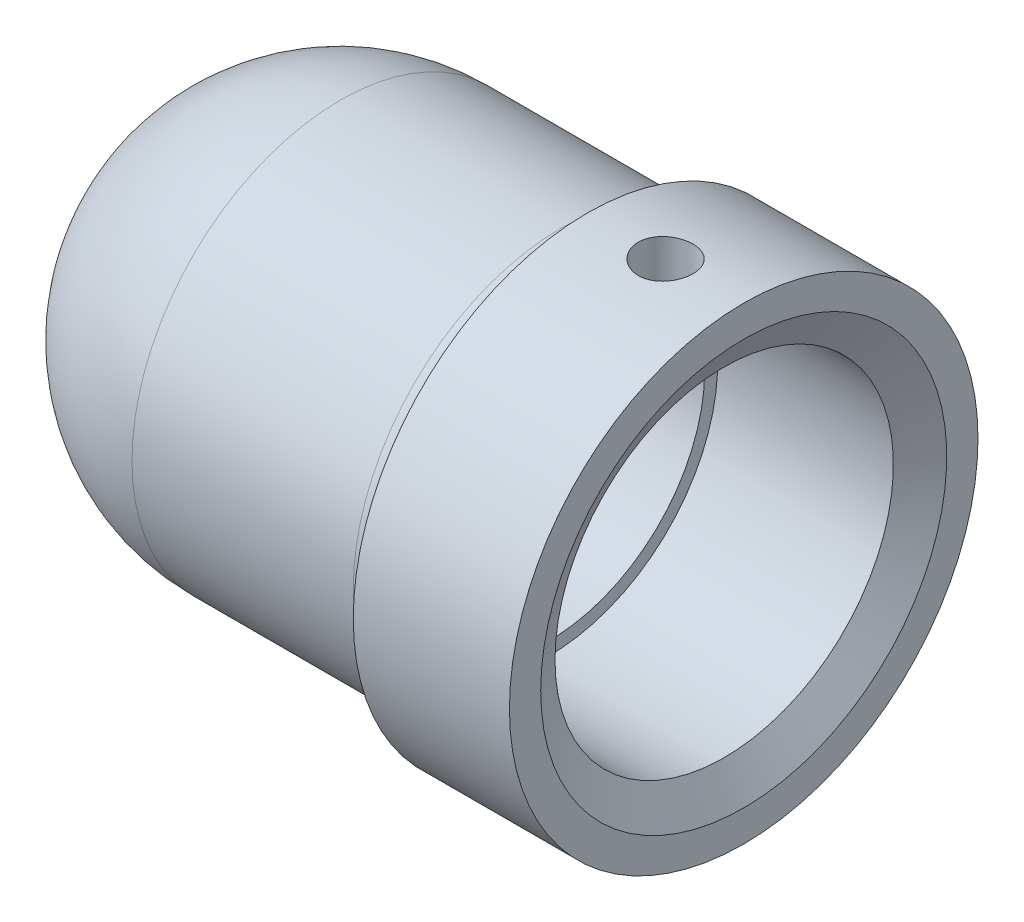
ISO-10303-21;
HEADER;
FILE_DESCRIPTION(('STEP AP214'),'2;1');
FILE_NAME('part.step','',(''),(''),'','','');
FILE_SCHEMA(('AUTOMOTIVE_DESIGN { 1 0 10303 214 1 1 1 1 }'));
ENDSEC;
DATA;
#1=APPLICATION_CONTEXT('core data for automotive mechanical design processes');
#2=APPLICATION_PROTOCOL_DEFINITION('international standard','automotive_design',2000,#1);
#3=PRODUCT_CONTEXT('',#1,'mechanical');
#4=PRODUCT('Part','Part','',(#3));
#5=PRODUCT_RELATED_PRODUCT_CATEGORY('part','',(#4));
#6=PRODUCT_DEFINITION_FORMATION('','',#4);
#7=PRODUCT_DEFINITION_CONTEXT('part definition',#1,'design');
#8=PRODUCT_DEFINITION('design','',#6,#7);
#9=PRODUCT_DEFINITION_SHAPE('','',#8);
#10=(LENGTH_UNIT() NAMED_UNIT(*) SI_UNIT(.MILLI.,.METRE.));
#11=(NAMED_UNIT(*) PLANE_ANGLE_UNIT() SI_UNIT($,.RADIAN.));
#12=(NAMED_UNIT(*) SI_UNIT($,.STERADIAN.) SOLID_ANGLE_UNIT());
#13=UNCERTAINTY_MEASURE_WITH_UNIT(LENGTH_MEASURE(1.E-05),#10,'distance_accuracy_value','');
#14=(GEOMETRIC_REPRESENTATION_CONTEXT(3) GLOBAL_UNCERTAINTY_ASSIGNED_CONTEXT((#13)) GLOBAL_UNIT_ASSIGNED_CONTEXT((#10,
#11,#12)) REPRESENTATION_CONTEXT('',''));
#15=CARTESIAN_POINT('',(0.,0.,0.));
#16=DIRECTION('',(0.,0.,1.));
#17=DIRECTION('',(1.,0.,0.));
#18=AXIS2_PLACEMENT_3D('',#15,#16,#17);
#19=CARTESIAN_POINT('',(-47.,0.,0.));
#20=DIRECTION('',(-1.,0.,0.));
#21=DIRECTION('',(0.,0.,1.));
#22=AXIS2_PLACEMENT_3D('',#19,#20,#21);
#23=CYLINDRICAL_SURFACE('',#22,18.);
#24=CARTESIAN_POINT('',(-6.,17.8770802985275,2.09999999999999));
#25=CARTESIAN_POINT('',(-6.11752645616681,17.8770818864204,2.09999496734066));
#26=CARTESIAN_POINT('',(-6.235127891991,17.8782517575098,2.0901006824873));
#27=CARTESIAN_POINT('',(-6.46706231413643,17.8828034722202,2.05078436303318));
#28=CARTESIAN_POINT('',(-6.58139168278845,17.8861876723897,2.0213415238432));
#29=CARTESIAN_POINT('',(-6.80339009875376,17.8947796228344,1.94380405102469));
#30=CARTESIAN_POINT('',(-6.91106344052113,17.8999861825685,1.89572159239352));
#31=CARTESIAN_POINT('',(-7.11679121928213,17.9116347599311,1.78229492172219));
#32=CARTESIAN_POINT('',(-7.21484739110572,17.9180765541152,1.71695383082906));
#33=CARTESIAN_POINT('',(-7.39905850158579,17.9315050853693,1.57052183285199));
#34=CARTESIAN_POINT('',(-7.4851596102785,17.9384940788681,1.48936340755517));
#35=CARTESIAN_POINT('',(-7.64255200455002,17.9522091735742,1.31374559042142));
#36=CARTESIAN_POINT('',(-7.71384257495208,17.9589352620735,1.21928555664088));
#37=CARTESIAN_POINT('',(-7.83978114657409,17.9713895546985,1.01941016968969));
#38=CARTESIAN_POINT('',(-7.89438076133712,17.9771148373621,0.913964131394348));
#39=CARTESIAN_POINT('',(-7.98507776521957,17.9868977093898,0.695321903094728));
#40=CARTESIAN_POINT('',(-8.02117575641367,17.990955353021,0.58212596542142));
#41=CARTESIAN_POINT('',(-8.07368489945681,17.9969298840528,0.351745814848304));
#42=CARTESIAN_POINT('',(-8.09018523981124,17.9988564670917,0.234582185589545));
#43=CARTESIAN_POINT('',(-8.10330694793459,18.0003848683715,-0.000865965834514741));
#44=CARTESIAN_POINT('',(-8.09992900252435,17.9999867669333,-0.119150449131855));
#45=CARTESIAN_POINT('',(-8.07346183055284,17.9969185305626,-0.352876323364038));
#46=CARTESIAN_POINT('',(-8.0504685173276,17.9942594513492,-0.468328741044821));
#47=CARTESIAN_POINT('',(-7.98557305502106,17.9869805436209,-0.693724797436983));
#48=CARTESIAN_POINT('',(-7.94367058619084,17.9823606819499,-0.803668342959832));
#49=CARTESIAN_POINT('',(-7.84204314361403,17.9716603516942,-1.01522462657681));
#50=CARTESIAN_POINT('',(-7.78227632870842,17.9655764607118,-1.11681708488158));
#51=CARTESIAN_POINT('',(-7.6466471687963,17.9526294571564,-1.30856611130692));
#52=CARTESIAN_POINT('',(-7.57078418058444,17.9457663134495,-1.39872222219934));
#53=CARTESIAN_POINT('',(-7.40457814567395,17.9319813991134,-1.56560223851656));
#54=CARTESIAN_POINT('',(-7.31415156264942,17.9250595227382,-1.64224296035511));
#55=CARTESIAN_POINT('',(-7.1216731289607,17.9119777702695,-1.77927104250137));
#56=CARTESIAN_POINT('',(-7.01962124979915,17.905817896044,-1.83965836296551));
#57=CARTESIAN_POINT('',(-6.80671863487478,17.8949574780013,-1.94246837033325));
#58=CARTESIAN_POINT('',(-6.69586491843214,17.8902574312136,-1.98488494049486));
#59=CARTESIAN_POINT('',(-6.468541385894,17.8828587604848,-2.05047848286092));
#60=CARTESIAN_POINT('',(-6.35207180473575,17.8801600528957,-2.07365625917429));
#61=CARTESIAN_POINT('',(-6.11755577763962,17.8770846613639,-2.10000525242062));
#62=CARTESIAN_POINT('',(-5.99952262753628,17.8766944195573,-2.10329328649739));
#63=CARTESIAN_POINT('',(-5.76458713594514,17.8782443194683,-2.09007717130031));
#64=CARTESIAN_POINT('',(-5.64768477357077,17.8801844180596,-2.07357338830369));
#65=CARTESIAN_POINT('',(-5.418675927714,17.8861640436326,-2.0213402581016));
#66=CARTESIAN_POINT('',(-5.30655647757573,17.8901974445467,-1.9856669998099));
#67=CARTESIAN_POINT('',(-5.08989139736234,17.8999042517962,-1.89616511689431));
#68=CARTESIAN_POINT('',(-4.98534600080134,17.905577708669,-1.84233593279786));
#69=CARTESIAN_POINT('',(-4.78626675665555,17.9179579816731,-1.71776105882806));
#70=CARTESIAN_POINT('',(-4.69178131941852,17.9246694441728,-1.64693847504007));
#71=CARTESIAN_POINT('',(-4.51599694781042,17.9383547201799,-1.49049643187036));
#72=CARTESIAN_POINT('',(-4.43469845935785,17.9453285425494,-1.40487647231544));
#73=CARTESIAN_POINT('',(-4.2871880781952,17.9587941676367,-1.22076106108728));
#74=CARTESIAN_POINT('',(-4.22105274921676,17.9652834171892,-1.12220405457313));
#75=CARTESIAN_POINT('',(-4.10627474946876,17.9770109351055,-0.915313233234862));
#76=CARTESIAN_POINT('',(-4.05763176554008,17.9822492258642,-0.806979593481697));
#77=CARTESIAN_POINT('',(-3.97934686886513,17.9908732183055,-0.583869692885966));
#78=CARTESIAN_POINT('',(-3.94965999730919,17.9942633006268,-0.469109383498855));
#79=CARTESIAN_POINT('',(-3.90998359093864,17.9988270254002,-0.236191108317691));
#80=CARTESIAN_POINT('',(-3.89999328800187,18.000000754285,-0.118033275201806));
#81=CARTESIAN_POINT('',(-3.90000667927658,17.9999992493617,0.117576836709851));
#82=CARTESIAN_POINT('',(-3.90989203463418,17.9988379184029,0.235029140027075));
#83=CARTESIAN_POINT('',(-3.94912638541441,17.9943243273082,0.466591522799102));
#84=CARTESIAN_POINT('',(-3.97847537881038,17.9909720674004,0.580701602601913));
#85=CARTESIAN_POINT('',(-4.05576824884148,17.982451784096,0.802329993460146));
#86=CARTESIAN_POINT('',(-4.10370722745843,17.9772842390176,0.909850032200096));
#87=CARTESIAN_POINT('',(-4.21680696803337,17.9657069524758,1.11533741947787));
#88=CARTESIAN_POINT('',(-4.28196782692261,17.9592972040209,1.213304714245));
#89=CARTESIAN_POINT('',(-4.42810195284893,17.945906330415,1.39751117316752));
#90=CARTESIAN_POINT('',(-4.50916337185366,17.9389221520962,1.48368018610945));
#91=CARTESIAN_POINT('',(-4.68461662291571,17.9251946044505,1.64124049803336));
#92=CARTESIAN_POINT('',(-4.77901162099352,17.9184512927944,1.7126282772974));
#93=CARTESIAN_POINT('',(-4.97881351239651,17.9059446975834,1.83880130231313));
#94=CARTESIAN_POINT('',(-5.08425651706147,17.9001848005505,1.89352966610306));
#95=CARTESIAN_POINT('',(-5.3028414681947,17.8903370303882,1.9844269015651));
#96=CARTESIAN_POINT('',(-5.41597477304573,17.8862473155469,2.02061622752467));
#97=CARTESIAN_POINT('',(-5.60809506067059,17.8812097988052,2.06461424564234));
#98=CARTESIAN_POINT('',(-5.68586393247999,17.8796688076276,2.07786516475665));
#99=CARTESIAN_POINT('',(-5.84241063467612,17.8776035282709,2.09555970170608));
#100=CARTESIAN_POINT('',(-5.92118845872605,17.8770792337095,2.10000337482853));
#101=CARTESIAN_POINT('',(-6.,17.8770802985275,2.09999999999999));
#102=B_SPLINE_CURVE_WITH_KNOTS('',3,(#24,#25,#26,#27,#28,#29,#30,#31,#32,#33,#34,#35,#36,#37,
#38,#39,#40,#41,#42,#43,#44,#45,#46,#47,#48,#49,#50,#51,#52,#53,#54,#55,#56,#57,#58,#59,#60,#61,
#62,#63,#64,#65,#66,#67,#68,#69,#70,#71,#72,#73,#74,#75,#76,#77,#78,#79,#80,#81,#82,#83,#84,#85,
#86,#87,#88,#89,#90,#91,#92,#93,#94,#95,#96,#97,#98,#99,#100,#101),.UNSPECIFIED.,.T.,.F.,(4,2,2,
2,2,2,2,2,2,2,2,2,2,2,2,2,2,2,2,2,2,2,2,2,2,2,2,2,2,2,2,2,2,2,2,2,2,2,4),(0.,0.35229149622184,
0.704958521659366,1.05739557968261,1.40976894461575,1.763680772691,2.11760968662127,
2.47255510444735,2.82748897100502,3.18080127473995,3.53410137114297,3.8856837719421,
4.23727211813123,4.58969048067586,4.94212292856122,5.29665405541565,5.65118605135951,
6.00583862334462,6.3604763714452,6.71302921022021,7.06557552457738,7.41709587868645,
7.76862706584061,8.12177994227905,8.47494475814266,8.82985536331887,9.18475961434264,
9.53881897024957,9.89286451835953,10.2448083362013,10.5967521173971,10.9486032327267,
11.3004563284493,11.6543182164622,12.008264269662,12.3634056212783,12.7181542937488,
12.9543973576015,13.190638938438),.UNSPECIFIED.);
#103=CARTESIAN_POINT('',(-6.,17.8770802985275,2.09999999999999));
#104=VERTEX_POINT('',#103);
#105=EDGE_CURVE('E10',#104,#104,#102,.T.);
#106=ORIENTED_EDGE('',*,*,#105,.T.);
#107=EDGE_LOOP('',(#106));
#108=FACE_BOUND('',#107,.T.);
#109=CARTESIAN_POINT('',(-12.,0.,0.));
#110=DIRECTION('',(-1.,0.,0.));
#111=DIRECTION('',(0.,0.,1.));
#112=AXIS2_PLACEMENT_3D('',#109,#110,#111);
#113=CIRCLE('',#112,18.);
#114=CARTESIAN_POINT('',(-12.,0.,18.));
#115=VERTEX_POINT('',#114);
#116=EDGE_CURVE('E75',#115,#115,#113,.T.);
#117=ORIENTED_EDGE('',*,*,#116,.F.);
#118=EDGE_LOOP('',(#117));
#119=FACE_BOUND('',#118,.T.);
#120=CARTESIAN_POINT('',(0.,0.,0.));
#121=DIRECTION('',(-1.,0.,0.));
#122=DIRECTION('',(0.,0.,1.));
#123=AXIS2_PLACEMENT_3D('',#120,#121,#122);
#124=CIRCLE('',#123,18.);
#125=CARTESIAN_POINT('',(0.,0.,18.));
#126=VERTEX_POINT('',#125);
#127=EDGE_CURVE('E95',#126,#126,#124,.T.);
#128=ORIENTED_EDGE('',*,*,#127,.T.);
#129=EDGE_LOOP('',(#128));
#130=FACE_BOUND('',#129,.T.);
#131=ADVANCED_FACE('F45',(#108,#119,#130),#23,.T.);
#132=CARTESIAN_POINT('',(-47.,0.,0.));
#133=DIRECTION('',(-1.,0.,0.));
#134=DIRECTION('',(0.,0.,1.));
#135=AXIS2_PLACEMENT_3D('',#132,#133,#134);
#136=CYLINDRICAL_SURFACE('',#135,16.);
#137=CARTESIAN_POINT('',(-14.,0.,0.));
#138=DIRECTION('',(1.,0.,0.));
#139=DIRECTION('',(0.,0.,-1.));
#140=AXIS2_PLACEMENT_3D('',#137,#138,#139);
#141=CIRCLE('',#140,16.);
#142=CARTESIAN_POINT('',(-14.,0.,-16.));
#143=VERTEX_POINT('',#142);
#144=EDGE_CURVE('E69',#143,#143,#141,.F.);
#145=ORIENTED_EDGE('',*,*,#144,.T.);
#146=EDGE_LOOP('',(#145));
#147=FACE_BOUND('',#146,.T.);
#148=CARTESIAN_POINT('',(-31.,0.,0.));
#149=DIRECTION('',(-1.,0.,0.));
#150=DIRECTION('',(0.,0.,1.));
#151=AXIS2_PLACEMENT_3D('',#148,#149,#150);
#152=CIRCLE('',#151,16.);
#153=CARTESIAN_POINT('',(-31.,0.,16.));
#154=VERTEX_POINT('',#153);
#155=EDGE_CURVE('E79',#154,#154,#152,.T.);
#156=ORIENTED_EDGE('',*,*,#155,.F.);
#157=EDGE_LOOP('',(#156));
#158=FACE_BOUND('',#157,.T.);
#159=ADVANCED_FACE('F128',(#147,#158),#136,.T.);
#160=CARTESIAN_POINT('',(-31.,0.,0.));
#161=DIRECTION('',(-1.,0.,0.));
#162=DIRECTION('',(0.,1.,0.));
#163=AXIS2_PLACEMENT_3D('',#160,#161,#162);
#164=SPHERICAL_SURFACE('',#163,16.);
#165=ORIENTED_EDGE('',*,*,#155,.T.);
#166=EDGE_LOOP('',(#165));
#167=FACE_BOUND('',#166,.T.);
#168=ADVANCED_FACE('F132',(#167),#164,.T.);
#169=CARTESIAN_POINT('',(-31.,0.,0.));
#170=DIRECTION('',(-1.,0.,0.));
#171=DIRECTION('',(0.,-1.,0.));
#172=AXIS2_PLACEMENT_3D('',#169,#170,#171);
#173=SPHERICAL_SURFACE('',#172,12.);
#174=CARTESIAN_POINT('',(-31.,0.,0.));
#175=DIRECTION('',(-1.,0.,0.));
#176=DIRECTION('',(0.,0.,1.));
#177=AXIS2_PLACEMENT_3D('',#174,#175,#176);
#178=CIRCLE('',#177,12.);
#179=CARTESIAN_POINT('',(-31.,0.,12.));
#180=VERTEX_POINT('',#179);
#181=EDGE_CURVE('E83',#180,#180,#178,.T.);
#182=ORIENTED_EDGE('',*,*,#181,.F.);
#183=EDGE_LOOP('',(#182));
#184=FACE_BOUND('',#183,.T.);
#185=ADVANCED_FACE('F140',(#184),#173,.F.);
#186=CARTESIAN_POINT('',(-47.,0.,0.));
#187=DIRECTION('',(-1.,0.,0.));
#188=DIRECTION('',(0.,0.,1.));
#189=AXIS2_PLACEMENT_3D('',#186,#187,#188);
#190=CYLINDRICAL_SURFACE('',#189,12.);
#191=CARTESIAN_POINT('',(-15.,0.,0.));
#192=DIRECTION('',(-1.,0.,0.));
#193=DIRECTION('',(0.,0.,1.));
#194=AXIS2_PLACEMENT_3D('',#191,#192,#193);
#195=CIRCLE('',#194,12.);
#196=CARTESIAN_POINT('',(-15.,0.,12.));
#197=VERTEX_POINT('',#196);
#198=EDGE_CURVE('E87',#197,#197,#195,.T.);
#199=ORIENTED_EDGE('',*,*,#198,.F.);
#200=EDGE_LOOP('',(#199));
#201=FACE_BOUND('',#200,.T.);
#202=ORIENTED_EDGE('',*,*,#181,.T.);
#203=EDGE_LOOP('',(#202));
#204=FACE_BOUND('',#203,.T.);
#205=ADVANCED_FACE('F144',(#201,#204),#190,.F.);
#206=CARTESIAN_POINT('',(-15.,12.,0.));
#207=DIRECTION('',(-1.,0.,0.));
#208=DIRECTION('',(0.,0.,1.));
#209=AXIS2_PLACEMENT_3D('',#206,#207,#208);
#210=PLANE('',#209);
#211=CARTESIAN_POINT('',(-15.,0.,0.));
#212=DIRECTION('',(-1.,0.,0.));
#213=DIRECTION('',(0.,0.,1.));
#214=AXIS2_PLACEMENT_3D('',#211,#212,#213);
#215=CIRCLE('',#214,13.);
#216=CARTESIAN_POINT('',(-15.,0.,13.));
#217=VERTEX_POINT('',#216);
#218=EDGE_CURVE('E91',#217,#217,#215,.T.);
#219=ORIENTED_EDGE('',*,*,#218,.F.);
#220=EDGE_LOOP('',(#219));
#221=FACE_BOUND('',#220,.T.);
#222=ORIENTED_EDGE('',*,*,#198,.T.);
#223=EDGE_LOOP('',(#222));
#224=FACE_BOUND('',#223,.T.);
#225=ADVANCED_FACE('F124',(#221,#224),#210,.F.);
#226=CARTESIAN_POINT('',(-47.,0.,0.));
#227=DIRECTION('',(-1.,0.,0.));
#228=DIRECTION('',(0.,0.,1.));
#229=AXIS2_PLACEMENT_3D('',#226,#227,#228);
#230=CYLINDRICAL_SURFACE('',#229,13.);
#231=CARTESIAN_POINT('',(-6.,12.8292634239071,2.09999999999999));
#232=CARTESIAN_POINT('',(-5.88287071414048,12.8292654929289,2.09999524890523));
#233=CARTESIAN_POINT('',(-5.76567617939393,12.830884858838,2.09016735047895));
#234=CARTESIAN_POINT('',(-5.53457167050811,12.8371819364284,2.05113038879794));
#235=CARTESIAN_POINT('',(-5.42066488596841,12.8418625202681,2.02190312389027));
#236=CARTESIAN_POINT('',(-5.19951410603195,12.8537383875686,1.94497146462564));
#237=CARTESIAN_POINT('',(-5.09226476970451,12.8609316237296,1.89728210969717));
#238=CARTESIAN_POINT('',(-4.88730274254683,12.8770198767998,1.78481682458169));
#239=CARTESIAN_POINT('',(-4.78958890439721,12.8859146885919,1.72004295349971));
#240=CARTESIAN_POINT('',(-4.605553376018,12.9044959892512,1.57460682803281));
#241=CARTESIAN_POINT('',(-4.51933286744318,12.9141884310935,1.49381728149883));
#242=CARTESIAN_POINT('',(-4.36160968374067,12.9332199375548,1.31891815417481));
#243=CARTESIAN_POINT('',(-4.2901078604399,12.942558981696,1.22480780299019));
#244=CARTESIAN_POINT('',(-4.16347395711029,12.9598942157763,1.02528519299712));
#245=CARTESIAN_POINT('',(-4.10843573791876,12.9678825972449,0.919812625856128));
#246=CARTESIAN_POINT('',(-4.01689436843555,12.9815502826702,0.700969042213666));
#247=CARTESIAN_POINT('',(-3.98039008518464,12.9872297277655,0.58759850898813));
#248=CARTESIAN_POINT('',(-3.92726142896037,12.9955976045503,0.357221544615438));
#249=CARTESIAN_POINT('',(-3.91046721839553,12.9983115748856,0.240255223490472));
#250=CARTESIAN_POINT('',(-3.89670755403499,13.0005303875825,0.00513550836021396));
#251=CARTESIAN_POINT('',(-3.89974083057969,13.0000354354286,-0.113017809151609));
#252=CARTESIAN_POINT('',(-3.92541708412065,12.9959124473986,-0.345997147549277));
#253=CARTESIAN_POINT('',(-3.94787730218072,12.9923136122018,-0.460843900467491));
#254=CARTESIAN_POINT('',(-4.01148238440932,12.9824197674574,-0.685116769766217));
#255=CARTESIAN_POINT('',(-4.05262779029033,12.9761246797417,-0.794542728887525));
#256=CARTESIAN_POINT('',(-4.15261864598365,12.9614957712914,-1.00541439612021));
#257=CARTESIAN_POINT('',(-4.2115399208968,12.953153245978,-1.10682352111585));
#258=CARTESIAN_POINT('',(-4.34535446645644,12.9353572609263,-1.29838410827844));
#259=CARTESIAN_POINT('',(-4.42024895319115,12.9259037166274,-1.38853471247161));
#260=CARTESIAN_POINT('',(-4.58489902868895,12.9068107770346,-1.5560982248581));
#261=CARTESIAN_POINT('',(-4.67481429928863,12.8971704916187,-1.63335420896292));
#262=CARTESIAN_POINT('',(-4.86641412478578,12.8788951056132,-1.77170707351364));
#263=CARTESIAN_POINT('',(-4.96809877588597,12.8702600132411,-1.83280382186083));
#264=CARTESIAN_POINT('',(-5.18052702241876,12.8549724726802,-1.93713166516613));
#265=CARTESIAN_POINT('',(-5.29127961701914,12.8483220252358,-1.98034474824248));
#266=CARTESIAN_POINT('',(-5.51860268453598,12.8377905681948,-2.04751074373919));
#267=CARTESIAN_POINT('',(-5.63517267720811,12.8339093303948,-2.07146524323139));
#268=CARTESIAN_POINT('',(-5.86942000427775,12.8293996264611,-2.09921495854837));
#269=CARTESIAN_POINT('',(-5.98707021524581,12.8287351322215,-2.10323347369273));
#270=CARTESIAN_POINT('',(-6.22136274575888,12.8306382883078,-2.09159139760148));
#271=CARTESIAN_POINT('',(-6.33800510162458,12.8332058216658,-2.07593151853162));
#272=CARTESIAN_POINT('',(-6.56626714435744,12.841250510832,-2.02556725161093));
#273=CARTESIAN_POINT('',(-6.67791240174656,12.8467104128338,-1.99097575616413));
#274=CARTESIAN_POINT('',(-6.89382096585454,12.8599102478941,-1.90384827341578));
#275=CARTESIAN_POINT('',(-6.99808385478985,12.8676503098639,-1.85131127151912));
#276=CARTESIAN_POINT('',(-7.19726413998145,12.8846224409588,-1.72925407557893));
#277=CARTESIAN_POINT('',(-7.29209249034317,12.8938668862644,-1.65959032254664));
#278=CARTESIAN_POINT('',(-7.46879293459923,12.9127696310077,-1.50545496473826));
#279=CARTESIAN_POINT('',(-7.5506641737767,12.9224279576938,-1.4209823838707));
#280=CARTESIAN_POINT('',(-7.69993748431847,12.9411837456236,-1.23863979441877));
#281=CARTESIAN_POINT('',(-7.76719093372786,12.9502748312571,-1.14064736322687));
#282=CARTESIAN_POINT('',(-7.88428034214789,12.9667705729496,-0.934625515587815));
#283=CARTESIAN_POINT('',(-7.93411683775374,12.9741752809614,-0.826596408488287));
#284=CARTESIAN_POINT('',(-8.01472440793648,12.9864361763474,-0.604016421802454));
#285=CARTESIAN_POINT('',(-8.04557436249435,12.9913028947982,-0.48949471356149));
#286=CARTESIAN_POINT('',(-8.08758755573905,12.9979838873415,-0.256811227746806));
#287=CARTESIAN_POINT('',(-8.09875231205992,12.9997983967442,-0.138649731497927));
#288=CARTESIAN_POINT('',(-8.10103661977814,13.0001675077494,0.0965224800057052));
#289=CARTESIAN_POINT('',(-8.09238270314668,12.9987589499046,0.213530999326331));
#290=CARTESIAN_POINT('',(-8.05576388930312,12.9929151045495,0.444405051936552));
#291=CARTESIAN_POINT('',(-8.0277990846211,12.988479831542,0.558270600283294));
#292=CARTESIAN_POINT('',(-7.95343718804525,12.9770789384662,0.779547680125578));
#293=CARTESIAN_POINT('',(-7.9070582267914,12.9701158079107,0.886965440729634));
#294=CARTESIAN_POINT('',(-7.79720940613683,12.9544208070858,1.09252977366321));
#295=CARTESIAN_POINT('',(-7.73373881656617,12.945688861255,1.19067594966016));
#296=CARTESIAN_POINT('',(-7.59070019510819,12.927306606111,1.37605481910416));
#297=CARTESIAN_POINT('',(-7.51096582183529,12.9176474023076,1.46315829455211));
#298=CARTESIAN_POINT('',(-7.33801255752254,12.8985621919482,1.62282974725057));
#299=CARTESIAN_POINT('',(-7.24479051182527,12.8891362405537,1.69539431447273));
#300=CARTESIAN_POINT('',(-7.04677950955262,12.871517727679,1.82436526356571));
#301=CARTESIAN_POINT('',(-6.94191827141197,12.8633337172593,1.88066183933197));
#302=CARTESIAN_POINT('',(-6.72414047231319,12.849226475202,1.97475620626453));
#303=CARTESIAN_POINT('',(-6.6112321917106,12.8433009583442,2.0125727071878));
#304=CARTESIAN_POINT('',(-6.41488509852623,12.8357133186117,2.06030225862091));
#305=CARTESIAN_POINT('',(-6.33264308252238,12.8333078559326,2.07516538398888));
#306=CARTESIAN_POINT('',(-6.16694508153294,12.8300821841768,2.09501586702944));
#307=CARTESIAN_POINT('',(-6.08348911646548,12.8292619491196,2.10000338655443));
#308=CARTESIAN_POINT('',(-6.,12.8292634239071,2.09999999999999));
#309=B_SPLINE_CURVE_WITH_KNOTS('',3,(#231,#232,#233,#234,#235,#236,#237,#238,#239,#240,#241,
#242,#243,#244,#245,#246,#247,#248,#249,#250,#251,#252,#253,#254,#255,#256,#257,#258,#259,#260,
#261,#262,#263,#264,#265,#266,#267,#268,#269,#270,#271,#272,#273,#274,#275,#276,#277,#278,#279,
#280,#281,#282,#283,#284,#285,#286,#287,#288,#289,#290,#291,#292,#293,#294,#295,#296,#297,#298,
#299,#300,#301,#302,#303,#304,#305,#306,#307,#308),.UNSPECIFIED.,.T.,.F.,(4,2,2,2,2,2,2,2,2,2,2,
2,2,2,2,2,2,2,2,2,2,2,2,2,2,2,2,2,2,2,2,2,2,2,2,2,2,2,4),(0.,0.351082599277138,
0.702495071902783,1.05362188025978,1.40470638851014,1.7587020740715,2.11271824096825,
2.46871582581237,2.82469164629276,3.17757703639786,3.53043982959333,3.88001873132843,
4.22960776854314,4.58070962613875,4.93183822371329,5.28696964888605,5.64210397710215,
5.99759512037468,6.35305696513589,6.7045282136903,7.05598674278321,7.4053719465286,
7.75477690693058,8.10721694491877,8.4596802219607,8.8155748529891,9.17145851836897,
9.52585349683562,9.8802211519601,10.2305585486047,10.5808942665836,10.9308858948758,
11.2808924775018,11.6346765696317,11.9885435431675,12.3447460628911,12.7005872019637,
12.9508410663792,13.2010908293224),.UNSPECIFIED.);
#310=CARTESIAN_POINT('',(-6.,12.8292634239071,2.09999999999999));
#311=VERTEX_POINT('',#310);
#312=EDGE_CURVE('E99',#311,#311,#309,.T.);
#313=ORIENTED_EDGE('',*,*,#312,.T.);
#314=EDGE_LOOP('',(#313));
#315=FACE_BOUND('',#314,.T.);
#316=CARTESIAN_POINT('',(-1.5,0.,0.));
#317=DIRECTION('',(-1.,0.,0.));
#318=DIRECTION('',(0.,0.,1.));
#319=AXIS2_PLACEMENT_3D('',#316,#317,#318);
#320=CIRCLE('',#319,13.);
#321=CARTESIAN_POINT('',(-1.5,0.,13.));
#322=VERTEX_POINT('',#321);
#323=EDGE_CURVE('E59',#322,#322,#320,.F.);
#324=ORIENTED_EDGE('',*,*,#323,.T.);
#325=EDGE_LOOP('',(#324));
#326=FACE_BOUND('',#325,.T.);
#327=ORIENTED_EDGE('',*,*,#218,.T.);
#328=EDGE_LOOP('',(#327));
#329=FACE_BOUND('',#328,.T.);
#330=ADVANCED_FACE('F106',(#315,#326,#329),#230,.F.);
#331=CARTESIAN_POINT('',(0.,13.,0.));
#332=DIRECTION('',(-1.,0.,0.));
#333=DIRECTION('',(0.,0.,1.));
#334=AXIS2_PLACEMENT_3D('',#331,#332,#333);
#335=PLANE('',#334);
#336=CARTESIAN_POINT('',(0.,0.,0.));
#337=DIRECTION('',(-1.,0.,0.));
#338=DIRECTION('',(0.,0.,1.));
#339=AXIS2_PLACEMENT_3D('',#336,#337,#338);
#340=CIRCLE('',#339,15.5980762113533);
#341=CARTESIAN_POINT('',(0.,0.,15.5980762113533));
#342=VERTEX_POINT('',#341);
#343=EDGE_CURVE('E64',#342,#342,#340,.T.);
#344=ORIENTED_EDGE('',*,*,#343,.T.);
#345=EDGE_LOOP('',(#344));
#346=FACE_BOUND('',#345,.T.);
#347=ORIENTED_EDGE('',*,*,#127,.F.);
#348=EDGE_LOOP('',(#347));
#349=FACE_BOUND('',#348,.T.);
#350=ADVANCED_FACE('F114',(#346,#349),#335,.F.);
#351=CARTESIAN_POINT('',(-14.,0.,0.));
#352=DIRECTION('',(1.,0.,0.));
#353=DIRECTION('',(0.,0.,-1.));
#354=AXIS2_PLACEMENT_3D('',#351,#352,#353);
#355=TOROIDAL_SURFACE('',#354,18.,2.);
#356=ORIENTED_EDGE('',*,*,#116,.T.);
#357=EDGE_LOOP('',(#356));
#358=FACE_BOUND('',#357,.T.);
#359=ORIENTED_EDGE('',*,*,#144,.F.);
#360=EDGE_LOOP('',(#359));
#361=FACE_BOUND('',#360,.T.);
#362=ADVANCED_FACE('F117',(#358,#361),#355,.F.);
#363=CARTESIAN_POINT('',(0.,0.,0.));
#364=DIRECTION('',(1.,0.,0.));
#365=DIRECTION('',(0.,0.,-1.));
#366=AXIS2_PLACEMENT_3D('',#363,#364,#365);
#367=CONICAL_SURFACE('',#366,15.5980762113533,1.04719755119659);
#368=ORIENTED_EDGE('',*,*,#323,.F.);
#369=EDGE_LOOP('',(#368));
#370=FACE_BOUND('',#369,.T.);
#371=ORIENTED_EDGE('',*,*,#343,.F.);
#372=EDGE_LOOP('',(#371));
#373=FACE_BOUND('',#372,.T.);
#374=ADVANCED_FACE('F48',(#370,#373),#367,.F.);
#375=CARTESIAN_POINT('',(-6.,18.,0.));
#376=DIRECTION('',(0.,1.,0.));
#377=DIRECTION('',(0.,0.,1.));
#378=AXIS2_PLACEMENT_3D('',#375,#376,#377);
#379=CYLINDRICAL_SURFACE('',#378,2.09999999999999);
#380=ORIENTED_EDGE('',*,*,#105,.F.);
#381=EDGE_LOOP('',(#380));
#382=FACE_BOUND('',#381,.T.);
#383=ORIENTED_EDGE('',*,*,#312,.F.);
#384=EDGE_LOOP('',(#383));
#385=FACE_BOUND('',#384,.T.);
#386=ADVANCED_FACE('F110',(#382,#385),#379,.F.);
#387=CLOSED_SHELL('',(#131,#159,#168,#185,#205,#225,#330,#350,#362,#374,#386));
#388=MANIFOLD_SOLID_BREP('B2',#387);
#389=ADVANCED_BREP_SHAPE_REPRESENTATION('',(#18,#388),#14);
#390=SHAPE_DEFINITION_REPRESENTATION(#9,#389);
ENDSEC;
END-ISO-10303-21;
